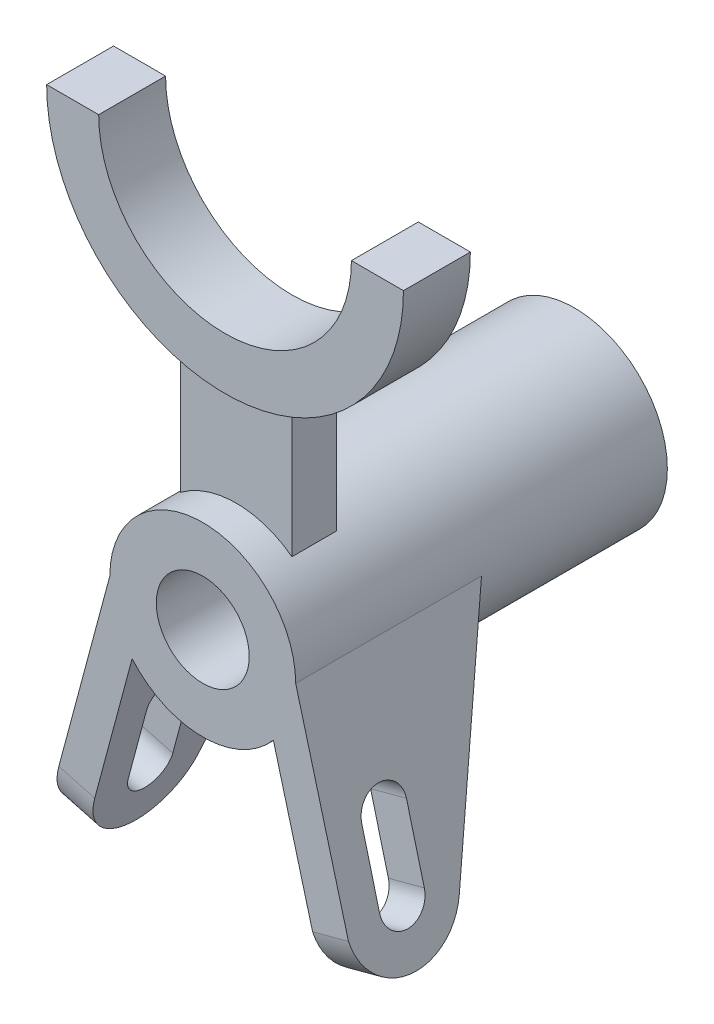
ISO-10303-21;
HEADER;
FILE_DESCRIPTION(('STEP AP214'),'2;1');
FILE_NAME('part.step','',(''),(''),'','','');
FILE_SCHEMA(('AUTOMOTIVE_DESIGN { 1 0 10303 214 1 1 1 1 }'));
ENDSEC;
DATA;
#1=APPLICATION_CONTEXT('core data for automotive mechanical design processes');
#2=APPLICATION_PROTOCOL_DEFINITION('international standard','automotive_design',2000,#1);
#3=PRODUCT_CONTEXT('',#1,'mechanical');
#4=PRODUCT('Part','Part','',(#3));
#5=PRODUCT_RELATED_PRODUCT_CATEGORY('part','',(#4));
#6=PRODUCT_DEFINITION_FORMATION('','',#4);
#7=PRODUCT_DEFINITION_CONTEXT('part definition',#1,'design');
#8=PRODUCT_DEFINITION('design','',#6,#7);
#9=PRODUCT_DEFINITION_SHAPE('','',#8);
#10=(LENGTH_UNIT() NAMED_UNIT(*) SI_UNIT(.MILLI.,.METRE.));
#11=(NAMED_UNIT(*) PLANE_ANGLE_UNIT() SI_UNIT($,.RADIAN.));
#12=(NAMED_UNIT(*) SI_UNIT($,.STERADIAN.) SOLID_ANGLE_UNIT());
#13=UNCERTAINTY_MEASURE_WITH_UNIT(LENGTH_MEASURE(1.E-05),#10,'distance_accuracy_value','');
#14=(GEOMETRIC_REPRESENTATION_CONTEXT(3) GLOBAL_UNCERTAINTY_ASSIGNED_CONTEXT((#13)) GLOBAL_UNIT_ASSIGNED_CONTEXT((#10,
#11,#12)) REPRESENTATION_CONTEXT('',''));
#15=CARTESIAN_POINT('',(0.,0.,0.));
#16=DIRECTION('',(0.,0.,1.));
#17=DIRECTION('',(1.,0.,0.));
#18=AXIS2_PLACEMENT_3D('',#15,#16,#17);
#19=CARTESIAN_POINT('',(0.,0.,-85.));
#20=DIRECTION('',(0.,0.,1.));
#21=DIRECTION('',(1.,0.,0.));
#22=AXIS2_PLACEMENT_3D('',#19,#20,#21);
#23=PLANE('',#22);
#24=CARTESIAN_POINT('',(0.,0.,-85.));
#25=DIRECTION('',(0.,0.,1.));
#26=DIRECTION('',(1.,0.,0.));
#27=AXIS2_PLACEMENT_3D('',#24,#25,#26);
#28=CIRCLE('',#27,25.);
#29=CARTESIAN_POINT('',(25.,0.,-85.));
#30=VERTEX_POINT('',#29);
#31=EDGE_CURVE('E376',#30,#30,#28,.T.);
#32=ORIENTED_EDGE('',*,*,#31,.F.);
#33=EDGE_LOOP('',(#32));
#34=FACE_BOUND('',#33,.T.);
#35=CARTESIAN_POINT('',(0.,0.,-85.));
#36=DIRECTION('',(0.,0.,-1.));
#37=DIRECTION('',(-1.,0.,0.));
#38=AXIS2_PLACEMENT_3D('',#35,#36,#37);
#39=CIRCLE('',#38,12.5);
#40=CARTESIAN_POINT('',(-12.5,0.,-85.));
#41=VERTEX_POINT('',#40);
#42=EDGE_CURVE('E835',#41,#41,#39,.T.);
#43=ORIENTED_EDGE('',*,*,#42,.F.);
#44=EDGE_LOOP('',(#43));
#45=FACE_BOUND('',#44,.T.);
#46=ADVANCED_FACE('F171',(#34,#45),#23,.F.);
#47=CARTESIAN_POINT('',(13.6660592844148,3.6618095489748,15.));
#48=DIRECTION('',(-0.965925826289068,-0.258819045102521,0.));
#49=DIRECTION('',(0.258819045102521,-0.965925826289068,0.));
#50=AXIS2_PLACEMENT_3D('',#47,#48,#49);
#51=PLANE('',#50);
#52=DIRECTION('',(-0.258813930198797,0.965906737208493,-0.0062868553582629));
#53=VECTOR('',#52,1.);
#54=CARTESIAN_POINT('',(13.6762362329052,3.62382866014261,-6.254308426666));
#55=LINE('',#54,#53);
#56=CARTESIAN_POINT('',(29.0679140749461,-53.8186950600859,-5.88042881269172));
#57=VERTEX_POINT('',#56);
#58=CARTESIAN_POINT('',(24.1503522179982,-35.4661043605937,-5.99988142517744));
#59=VERTEX_POINT('',#58);
#60=EDGE_CURVE('E548',#57,#59,#55,.T.);
#61=ORIENTED_EDGE('',*,*,#60,.T.);
#62=CARTESIAN_POINT('',(24.1405892705951,-35.4296685448535,0.));
#63=DIRECTION('',(0.965925826289068,0.258819045102521,0.));
#64=DIRECTION('',(-0.258819045102521,0.965925826289068,0.));
#65=AXIS2_PLACEMENT_3D('',#62,#63,#64);
#66=CIRCLE('',#65,5.99999999999999);
#67=CARTESIAN_POINT('',(24.1308263231919,-35.3932327291135,5.99988142517744));
#68=VERTEX_POINT('',#67);
#69=EDGE_CURVE('E551',#59,#68,#66,.T.);
#70=ORIENTED_EDGE('',*,*,#69,.T.);
#71=DIRECTION('',(-0.258813930198797,0.965906737208493,-0.00628685535826281));
#72=VECTOR('',#71,1.);
#73=CARTESIAN_POINT('',(13.6567103380989,3.69670029162289,5.74545442368889));
#74=LINE('',#73,#72);
#75=CARTESIAN_POINT('',(29.0483881801398,-53.7458234286057,6.11933403766316));
#76=VERTEX_POINT('',#75);
#77=EDGE_CURVE('E555',#76,#68,#74,.T.);
#78=ORIENTED_EDGE('',*,*,#77,.F.);
#79=CARTESIAN_POINT('',(29.058151127543,-53.7822592443458,0.119452612485716));
#80=DIRECTION('',(0.965925826289068,0.258819045102521,0.));
#81=DIRECTION('',(-0.258819045102521,0.965925826289068,0.));
#82=AXIS2_PLACEMENT_3D('',#79,#80,#81);
#83=CIRCLE('',#82,5.99999999999999);
#84=EDGE_CURVE('E557',#76,#57,#83,.T.);
#85=ORIENTED_EDGE('',*,*,#84,.T.);
#86=EDGE_LOOP('',(#61,#70,#78,#85));
#87=FACE_BOUND('',#86,.T.);
#88=CARTESIAN_POINT('',(29.058151127543,-53.7822592443458,0.119452612485716));
#89=DIRECTION('',(0.965925826289068,0.258819045102521,0.));
#90=DIRECTION('',(-0.258819045102521,0.965925826289068,0.));
#91=AXIS2_PLACEMENT_3D('',#88,#89,#90);
#92=CIRCLE('',#91,15.);
#93=CARTESIAN_POINT('',(30.3785552849601,-58.7100746463516,-13.9863323080648));
#94=VERTEX_POINT('',#93);
#95=CARTESIAN_POINT('',(29.5471280145511,-55.6071458303872,15.));
#96=VERTEX_POINT('',#95);
#97=EDGE_CURVE('E542',#94,#96,#92,.F.);
#98=ORIENTED_EDGE('',*,*,#97,.T.);
#99=DIRECTION('',(-0.258819045102521,0.965925826289068,0.));
#100=VECTOR('',#99,1.);
#101=CARTESIAN_POINT('',(13.6660592844148,3.6618095489748,15.));
#102=LINE('',#101,#100);
#103=CARTESIAN_POINT('',(19.0006831834728,-16.2472778815805,15.));
#104=VERTEX_POINT('',#103);
#105=EDGE_CURVE('E360',#96,#104,#102,.T.);
#106=ORIENTED_EDGE('',*,*,#105,.T.);
#107=DIRECTION('',(0.,0.,-1.));
#108=VECTOR('',#107,1.);
#109=CARTESIAN_POINT('',(19.0006831834728,-16.2472778815805,15.));
#110=LINE('',#109,#108);
#111=CARTESIAN_POINT('',(19.0006831834727,-16.2472778815805,-29.885639918257));
#112=VERTEX_POINT('',#111);
#113=EDGE_CURVE('E355',#104,#112,#110,.T.);
#114=ORIENTED_EDGE('',*,*,#113,.T.);
#115=DIRECTION('',(0.243389718903895,-0.908342796989242,0.340109993810301));
#116=VECTOR('',#115,1.);
#117=CARTESIAN_POINT('',(16.7570525080527,-7.87393420749297,-33.0208636186099));
#118=LINE('',#117,#116);
#119=EDGE_CURVE('E333',#112,#94,#118,.T.);
#120=ORIENTED_EDGE('',*,*,#119,.T.);
#121=EDGE_LOOP('',(#98,#106,#114,#120));
#122=FACE_BOUND('',#121,.T.);
#123=ADVANCED_FACE('F468',(#87,#122),#51,.T.);
#124=CARTESIAN_POINT('',(23.3253175473055,6.25000000000001,15.));
#125=DIRECTION('',(0.965925826289068,0.258819045102521,0.));
#126=DIRECTION('',(-0.258819045102521,0.965925826289068,0.));
#127=AXIS2_PLACEMENT_3D('',#124,#125,#126);
#128=PLANE('',#127);
#129=DIRECTION('',(-0.258813930198797,0.965906737208493,-0.0062868553582629));
#130=VECTOR('',#129,1.);
#131=CARTESIAN_POINT('',(23.3354944957959,6.21201911116782,-6.254308426666));
#132=LINE('',#131,#130);
#133=CARTESIAN_POINT('',(38.7271723378368,-51.2305046090607,-5.88042881269172));
#134=VERTEX_POINT('',#133);
#135=CARTESIAN_POINT('',(33.8096104808889,-32.8779139095685,-5.99988142517744));
#136=VERTEX_POINT('',#135);
#137=EDGE_CURVE('E547',#134,#136,#132,.T.);
#138=ORIENTED_EDGE('',*,*,#137,.F.);
#139=CARTESIAN_POINT('',(38.7174093904336,-51.1940687933206,0.119452612485716));
#140=DIRECTION('',(0.965925826289068,0.258819045102521,0.));
#141=DIRECTION('',(-0.258819045102521,0.965925826289068,0.));
#142=AXIS2_PLACEMENT_3D('',#139,#140,#141);
#143=CIRCLE('',#142,5.99999999999999);
#144=CARTESIAN_POINT('',(38.7076464430305,-51.1576329775805,6.11933403766316));
#145=VERTEX_POINT('',#144);
#146=EDGE_CURVE('E552',#145,#134,#143,.T.);
#147=ORIENTED_EDGE('',*,*,#146,.F.);
#148=DIRECTION('',(-0.258813930198797,0.965906737208493,-0.00628685535826281));
#149=VECTOR('',#148,1.);
#150=CARTESIAN_POINT('',(23.3159686009896,6.2848907426481,5.74545442368889));
#151=LINE('',#150,#149);
#152=CARTESIAN_POINT('',(33.7900845860826,-32.8050422780883,5.99988142517744));
#153=VERTEX_POINT('',#152);
#154=EDGE_CURVE('E564',#145,#153,#151,.T.);
#155=ORIENTED_EDGE('',*,*,#154,.T.);
#156=CARTESIAN_POINT('',(33.7998475334857,-32.8414780938283,0.));
#157=DIRECTION('',(0.965925826289068,0.258819045102521,0.));
#158=DIRECTION('',(-0.258819045102521,0.965925826289068,0.));
#159=AXIS2_PLACEMENT_3D('',#156,#157,#158);
#160=CIRCLE('',#159,5.99999999999999);
#161=EDGE_CURVE('E562',#136,#153,#160,.T.);
#162=ORIENTED_EDGE('',*,*,#161,.F.);
#163=EDGE_LOOP('',(#138,#147,#155,#162));
#164=FACE_BOUND('',#163,.T.);
#165=DIRECTION('',(0.258819045102521,-0.965925826289068,0.));
#166=VECTOR('',#165,1.);
#167=CARTESIAN_POINT('',(23.3253175473055,6.25000000000001,15.));
#168=LINE('',#167,#166);
#169=CARTESIAN_POINT('',(25.,0.,15.));
#170=VERTEX_POINT('',#169);
#171=CARTESIAN_POINT('',(39.2063862774418,-53.018955379362,15.));
#172=VERTEX_POINT('',#171);
#173=EDGE_CURVE('E356',#170,#172,#168,.T.);
#174=ORIENTED_EDGE('',*,*,#173,.T.);
#175=CARTESIAN_POINT('',(38.7174093904336,-51.1940687933206,0.119452612485716));
#176=DIRECTION('',(0.965925826289068,0.258819045102521,0.));
#177=DIRECTION('',(-0.258819045102521,0.965925826289068,0.));
#178=AXIS2_PLACEMENT_3D('',#175,#176,#177);
#179=CIRCLE('',#178,15.);
#180=CARTESIAN_POINT('',(40.0378135478507,-56.1218841953264,-13.9863323080648));
#181=VERTEX_POINT('',#180);
#182=EDGE_CURVE('E348',#181,#172,#179,.F.);
#183=ORIENTED_EDGE('',*,*,#182,.F.);
#184=DIRECTION('',(0.243389718903895,-0.908342796989242,0.340109993810301));
#185=VECTOR('',#184,1.);
#186=CARTESIAN_POINT('',(26.4163107709434,-5.28574375646776,-33.0208636186099));
#187=LINE('',#186,#185);
#188=CARTESIAN_POINT('',(25.,0.,-35.));
#189=VERTEX_POINT('',#188);
#190=EDGE_CURVE('E194',#189,#181,#187,.T.);
#191=ORIENTED_EDGE('',*,*,#190,.F.);
#192=DIRECTION('',(0.,0.,-1.));
#193=VECTOR('',#192,1.);
#194=CARTESIAN_POINT('',(25.,0.,15.));
#195=LINE('',#194,#193);
#196=EDGE_CURVE('E346',#170,#189,#195,.T.);
#197=ORIENTED_EDGE('',*,*,#196,.F.);
#198=EDGE_LOOP('',(#174,#183,#191,#197));
#199=FACE_BOUND('',#198,.T.);
#200=ADVANCED_FACE('F345',(#164,#199),#128,.T.);
#201=CARTESIAN_POINT('',(-13.6660592844148,3.6618095489748,-35.));
#202=DIRECTION('',(0.965925826289068,-0.258819045102521,0.));
#203=DIRECTION('',(0.258819045102521,0.965925826289068,0.));
#204=AXIS2_PLACEMENT_3D('',#201,#202,#203);
#205=PLANE('',#204);
#206=DIRECTION('',(0.258819045102521,0.965925826289068,0.));
#207=VECTOR('',#206,1.);
#208=CARTESIAN_POINT('',(-13.6660592844148,3.6618095489748,15.));
#209=LINE('',#208,#207);
#210=CARTESIAN_POINT('',(-29.058151127543,-53.7822592443458,15.));
#211=VERTEX_POINT('',#210);
#212=CARTESIAN_POINT('',(-19.0006831834728,-16.2472778815805,15.));
#213=VERTEX_POINT('',#212);
#214=EDGE_CURVE('E366',#211,#213,#209,.T.);
#215=ORIENTED_EDGE('',*,*,#214,.F.);
#216=CARTESIAN_POINT('',(-29.058151127543,-53.7822592443458,0.));
#217=DIRECTION('',(-0.965925826289068,0.258819045102521,0.));
#218=DIRECTION('',(-0.258819045102521,-0.965925826289068,0.));
#219=AXIS2_PLACEMENT_3D('',#216,#217,#218);
#220=CIRCLE('',#219,15.);
#221=CARTESIAN_POINT('',(-30.3719096495072,-58.6852727971928,-14.1150450458567));
#222=VERTEX_POINT('',#221);
#223=EDGE_CURVE('E612',#211,#222,#220,.F.);
#224=ORIENTED_EDGE('',*,*,#223,.T.);
#225=DIRECTION('',(0.243549498689848,0.90893910326844,-0.33839820956602));
#226=VECTOR('',#225,1.);
#227=CARTESIAN_POINT('',(-16.7424177797145,-7.81931665777995,-33.0524506691216));
#228=LINE('',#227,#226);
#229=CARTESIAN_POINT('',(-19.0006831834727,-16.2472778815805,-29.9147190233265));
#230=VERTEX_POINT('',#229);
#231=EDGE_CURVE('E615',#222,#230,#228,.T.);
#232=ORIENTED_EDGE('',*,*,#231,.T.);
#233=DIRECTION('',(0.,0.,1.));
#234=VECTOR('',#233,1.);
#235=CARTESIAN_POINT('',(-19.0006831834728,-16.2472778815805,-35.));
#236=LINE('',#235,#234);
#237=EDGE_CURVE('E369',#230,#213,#236,.T.);
#238=ORIENTED_EDGE('',*,*,#237,.T.);
#239=EDGE_LOOP('',(#215,#224,#232,#238));
#240=FACE_BOUND('',#239,.T.);
#241=DIRECTION('',(0.258819045102521,0.965925826289068,0.));
#242=VECTOR('',#241,1.);
#243=CARTESIAN_POINT('',(-13.6660592844148,3.6618095489748,6.));
#244=LINE('',#243,#242);
#245=CARTESIAN_POINT('',(-29.058151127543,-53.7822592443458,6.));
#246=VERTEX_POINT('',#245);
#247=CARTESIAN_POINT('',(-24.140589270595,-35.4296685448535,6.));
#248=VERTEX_POINT('',#247);
#249=EDGE_CURVE('E577',#246,#248,#244,.T.);
#250=ORIENTED_EDGE('',*,*,#249,.T.);
#251=CARTESIAN_POINT('',(-24.1405892705951,-35.4296685448535,0.));
#252=DIRECTION('',(-0.965925826289068,0.258819045102521,0.));
#253=DIRECTION('',(-0.258819045102521,-0.965925826289068,0.));
#254=AXIS2_PLACEMENT_3D('',#251,#252,#253);
#255=CIRCLE('',#254,6.);
#256=CARTESIAN_POINT('',(-24.1405892705951,-35.4296685448535,-6.));
#257=VERTEX_POINT('',#256);
#258=EDGE_CURVE('E580',#248,#257,#255,.T.);
#259=ORIENTED_EDGE('',*,*,#258,.T.);
#260=DIRECTION('',(0.258819045102521,0.965925826289068,0.));
#261=VECTOR('',#260,1.);
#262=CARTESIAN_POINT('',(-13.6660592844148,3.6618095489748,-6.));
#263=LINE('',#262,#261);
#264=CARTESIAN_POINT('',(-29.058151127543,-53.7822592443458,-6.));
#265=VERTEX_POINT('',#264);
#266=EDGE_CURVE('E584',#265,#257,#263,.T.);
#267=ORIENTED_EDGE('',*,*,#266,.F.);
#268=CARTESIAN_POINT('',(-29.058151127543,-53.7822592443458,0.));
#269=DIRECTION('',(-0.965925826289068,0.258819045102521,0.));
#270=DIRECTION('',(-0.258819045102521,-0.965925826289068,0.));
#271=AXIS2_PLACEMENT_3D('',#268,#269,#270);
#272=CIRCLE('',#271,6.);
#273=EDGE_CURVE('E587',#265,#246,#272,.T.);
#274=ORIENTED_EDGE('',*,*,#273,.T.);
#275=EDGE_LOOP('',(#250,#259,#267,#274));
#276=FACE_BOUND('',#275,.T.);
#277=ADVANCED_FACE('F526',(#240,#276),#205,.T.);
#278=CARTESIAN_POINT('',(-23.3253175473055,6.25000000000001,-35.));
#279=DIRECTION('',(-0.965925826289068,0.258819045102521,0.));
#280=DIRECTION('',(-0.258819045102521,-0.965925826289068,0.));
#281=AXIS2_PLACEMENT_3D('',#278,#279,#280);
#282=PLANE('',#281);
#283=CARTESIAN_POINT('',(-38.7174093904336,-51.1940687933206,0.));
#284=DIRECTION('',(-0.965925826289068,0.258819045102521,0.));
#285=DIRECTION('',(-0.258819045102521,-0.965925826289068,0.));
#286=AXIS2_PLACEMENT_3D('',#283,#284,#285);
#287=CIRCLE('',#286,15.);
#288=CARTESIAN_POINT('',(-38.7174093904336,-51.1940687933206,15.));
#289=VERTEX_POINT('',#288);
#290=CARTESIAN_POINT('',(-40.0311679123978,-56.0970823461676,-14.1150450458567));
#291=VERTEX_POINT('',#290);
#292=EDGE_CURVE('E611',#289,#291,#287,.F.);
#293=ORIENTED_EDGE('',*,*,#292,.F.);
#294=DIRECTION('',(-0.258819045102521,-0.965925826289068,0.));
#295=VECTOR('',#294,1.);
#296=CARTESIAN_POINT('',(-23.3253175473055,6.25000000000001,15.));
#297=LINE('',#296,#295);
#298=CARTESIAN_POINT('',(-25.,0.,15.));
#299=VERTEX_POINT('',#298);
#300=EDGE_CURVE('E358',#299,#289,#297,.T.);
#301=ORIENTED_EDGE('',*,*,#300,.F.);
#302=DIRECTION('',(0.,0.,1.));
#303=VECTOR('',#302,1.);
#304=CARTESIAN_POINT('',(-25.,0.,-35.));
#305=LINE('',#304,#303);
#306=CARTESIAN_POINT('',(-25.,0.,-35.));
#307=VERTEX_POINT('',#306);
#308=EDGE_CURVE('E368',#307,#299,#305,.T.);
#309=ORIENTED_EDGE('',*,*,#308,.F.);
#310=DIRECTION('',(0.243549498689848,0.90893910326844,-0.33839820956602));
#311=VECTOR('',#310,1.);
#312=CARTESIAN_POINT('',(-26.4016760426052,-5.23112620675473,-33.0524506691216));
#313=LINE('',#312,#311);
#314=EDGE_CURVE('E616',#291,#307,#313,.T.);
#315=ORIENTED_EDGE('',*,*,#314,.F.);
#316=EDGE_LOOP('',(#293,#301,#309,#315));
#317=FACE_BOUND('',#316,.T.);
#318=DIRECTION('',(0.258819045102521,0.965925826289068,0.));
#319=VECTOR('',#318,1.);
#320=CARTESIAN_POINT('',(-23.3253175473055,6.25000000000001,6.));
#321=LINE('',#320,#319);
#322=CARTESIAN_POINT('',(-38.7174093904336,-51.1940687933206,6.));
#323=VERTEX_POINT('',#322);
#324=CARTESIAN_POINT('',(-33.7998475334857,-32.8414780938283,6.));
#325=VERTEX_POINT('',#324);
#326=EDGE_CURVE('E571',#323,#325,#321,.T.);
#327=ORIENTED_EDGE('',*,*,#326,.F.);
#328=CARTESIAN_POINT('',(-38.7174093904336,-51.1940687933206,0.));
#329=DIRECTION('',(-0.965925826289068,0.258819045102521,0.));
#330=DIRECTION('',(-0.258819045102521,-0.965925826289068,0.));
#331=AXIS2_PLACEMENT_3D('',#328,#329,#330);
#332=CIRCLE('',#331,6.);
#333=CARTESIAN_POINT('',(-38.7174093904336,-51.1940687933206,-6.));
#334=VERTEX_POINT('',#333);
#335=EDGE_CURVE('E581',#334,#323,#332,.T.);
#336=ORIENTED_EDGE('',*,*,#335,.F.);
#337=DIRECTION('',(0.258819045102521,0.965925826289068,0.));
#338=VECTOR('',#337,1.);
#339=CARTESIAN_POINT('',(-23.3253175473055,6.25000000000001,-6.));
#340=LINE('',#339,#338);
#341=CARTESIAN_POINT('',(-33.7998475334857,-32.8414780938283,-6.));
#342=VERTEX_POINT('',#341);
#343=EDGE_CURVE('E595',#334,#342,#340,.T.);
#344=ORIENTED_EDGE('',*,*,#343,.T.);
#345=CARTESIAN_POINT('',(-33.7998475334857,-32.8414780938283,0.));
#346=DIRECTION('',(-0.965925826289068,0.258819045102521,0.));
#347=DIRECTION('',(-0.258819045102521,-0.965925826289068,0.));
#348=AXIS2_PLACEMENT_3D('',#345,#346,#347);
#349=CIRCLE('',#348,6.);
#350=EDGE_CURVE('E592',#325,#342,#349,.T.);
#351=ORIENTED_EDGE('',*,*,#350,.F.);
#352=EDGE_LOOP('',(#327,#336,#344,#351));
#353=FACE_BOUND('',#352,.T.);
#354=ADVANCED_FACE('F521',(#317,#353),#282,.T.);
#355=CARTESIAN_POINT('',(0.,0.,15.));
#356=DIRECTION('',(0.,0.,1.));
#357=DIRECTION('',(1.,0.,0.));
#358=AXIS2_PLACEMENT_3D('',#355,#356,#357);
#359=PLANE('',#358);
#360=CARTESIAN_POINT('',(0.,0.,15.));
#361=DIRECTION('',(0.,0.,1.));
#362=DIRECTION('',(1.,0.,0.));
#363=AXIS2_PLACEMENT_3D('',#360,#361,#362);
#364=CIRCLE('',#363,12.5);
#365=CARTESIAN_POINT('',(12.5,0.,15.));
#366=VERTEX_POINT('',#365);
#367=EDGE_CURVE('E339',#366,#366,#364,.T.);
#368=ORIENTED_EDGE('',*,*,#367,.F.);
#369=EDGE_LOOP('',(#368));
#370=FACE_BOUND('',#369,.T.);
#371=ORIENTED_EDGE('',*,*,#173,.F.);
#372=CARTESIAN_POINT('',(0.,0.,15.));
#373=DIRECTION('',(0.,0.,1.));
#374=DIRECTION('',(1.,0.,0.));
#375=AXIS2_PLACEMENT_3D('',#372,#373,#374);
#376=CIRCLE('',#375,25.);
#377=EDGE_CURVE('E354',#170,#299,#376,.T.);
#378=ORIENTED_EDGE('',*,*,#377,.T.);
#379=ORIENTED_EDGE('',*,*,#300,.T.);
#380=DIRECTION('',(-0.965925826289068,0.258819045102521,0.));
#381=VECTOR('',#380,1.);
#382=CARTESIAN_POINT('',(-29.058151127543,-53.7822592443458,15.));
#383=LINE('',#382,#381);
#384=EDGE_CURVE('E602',#211,#289,#383,.T.);
#385=ORIENTED_EDGE('',*,*,#384,.F.);
#386=ORIENTED_EDGE('',*,*,#214,.T.);
#387=EDGE_CURVE('E373',#213,#104,#376,.T.);
#388=ORIENTED_EDGE('',*,*,#387,.T.);
#389=ORIENTED_EDGE('',*,*,#105,.F.);
#390=DIRECTION('',(0.965925826289068,0.258819045102521,0.));
#391=VECTOR('',#390,1.);
#392=CARTESIAN_POINT('',(29.5471280145511,-55.6071458303872,15.));
#393=LINE('',#392,#391);
#394=EDGE_CURVE('E349',#96,#172,#393,.T.);
#395=ORIENTED_EDGE('',*,*,#394,.T.);
#396=EDGE_LOOP('',(#371,#378,#379,#385,#386,#388,#389,#395));
#397=FACE_BOUND('',#396,.T.);
#398=ADVANCED_FACE('F480',(#370,#397),#359,.T.);
#399=CARTESIAN_POINT('',(0.,100.,9.));
#400=DIRECTION('',(0.,0.,-1.));
#401=DIRECTION('',(-1.,0.,0.));
#402=AXIS2_PLACEMENT_3D('',#399,#400,#401);
#403=CYLINDRICAL_SURFACE('',#402,34.);
#404=CARTESIAN_POINT('',(0.,100.,-9.));
#405=DIRECTION('',(0.,0.,1.));
#406=DIRECTION('',(1.,0.,0.));
#407=AXIS2_PLACEMENT_3D('',#404,#405,#406);
#408=CIRCLE('',#407,34.);
#409=CARTESIAN_POINT('',(-34.,100.,-9.));
#410=VERTEX_POINT('',#409);
#411=CARTESIAN_POINT('',(34.,100.,-9.));
#412=VERTEX_POINT('',#411);
#413=EDGE_CURVE('E411',#410,#412,#408,.T.);
#414=ORIENTED_EDGE('',*,*,#413,.F.);
#415=DIRECTION('',(0.,0.,-1.));
#416=VECTOR('',#415,1.);
#417=CARTESIAN_POINT('',(-34.,100.,9.));
#418=LINE('',#417,#416);
#419=CARTESIAN_POINT('',(-34.,100.,9.));
#420=VERTEX_POINT('',#419);
#421=EDGE_CURVE('E12',#420,#410,#418,.T.);
#422=ORIENTED_EDGE('',*,*,#421,.F.);
#423=CARTESIAN_POINT('',(0.,100.,9.));
#424=DIRECTION('',(0.,0.,1.));
#425=DIRECTION('',(1.,0.,0.));
#426=AXIS2_PLACEMENT_3D('',#423,#424,#425);
#427=CIRCLE('',#426,34.);
#428=CARTESIAN_POINT('',(34.,100.,9.));
#429=VERTEX_POINT('',#428);
#430=EDGE_CURVE('E412',#420,#429,#427,.T.);
#431=ORIENTED_EDGE('',*,*,#430,.T.);
#432=DIRECTION('',(0.,0.,-1.));
#433=VECTOR('',#432,1.);
#434=CARTESIAN_POINT('',(34.,100.,9.));
#435=LINE('',#434,#433);
#436=EDGE_CURVE('E424',#429,#412,#435,.T.);
#437=ORIENTED_EDGE('',*,*,#436,.T.);
#438=EDGE_LOOP('',(#414,#422,#431,#437));
#439=FACE_BOUND('',#438,.T.);
#440=ADVANCED_FACE('F173',(#439),#403,.F.);
#441=CARTESIAN_POINT('',(0.,100.,9.));
#442=DIRECTION('',(0.,1.,0.));
#443=DIRECTION('',(0.,0.,1.));
#444=AXIS2_PLACEMENT_3D('',#441,#442,#443);
#445=PLANE('',#444);
#446=DIRECTION('',(1.,0.,0.));
#447=VECTOR('',#446,1.);
#448=CARTESIAN_POINT('',(0.,100.,-9.));
#449=LINE('',#448,#447);
#450=CARTESIAN_POINT('',(-48.,100.,-9.));
#451=VERTEX_POINT('',#450);
#452=EDGE_CURVE('E427',#451,#410,#449,.T.);
#453=ORIENTED_EDGE('',*,*,#452,.F.);
#454=DIRECTION('',(0.,0.,-1.));
#455=VECTOR('',#454,1.);
#456=CARTESIAN_POINT('',(-48.,100.,9.));
#457=LINE('',#456,#455);
#458=CARTESIAN_POINT('',(-48.,100.,9.));
#459=VERTEX_POINT('',#458);
#460=EDGE_CURVE('E179',#459,#451,#457,.T.);
#461=ORIENTED_EDGE('',*,*,#460,.F.);
#462=DIRECTION('',(1.,0.,0.));
#463=VECTOR('',#462,1.);
#464=CARTESIAN_POINT('',(0.,100.,9.));
#465=LINE('',#464,#463);
#466=EDGE_CURVE('E415',#459,#420,#465,.T.);
#467=ORIENTED_EDGE('',*,*,#466,.T.);
#468=ORIENTED_EDGE('',*,*,#421,.T.);
#469=EDGE_LOOP('',(#453,#461,#467,#468));
#470=FACE_BOUND('',#469,.T.);
#471=ADVANCED_FACE('F448',(#470),#445,.T.);
#472=CARTESIAN_POINT('',(0.,100.,9.));
#473=DIRECTION('',(0.,0.,-1.));
#474=DIRECTION('',(-1.,0.,0.));
#475=AXIS2_PLACEMENT_3D('',#472,#473,#474);
#476=CYLINDRICAL_SURFACE('',#475,48.);
#477=DIRECTION('',(0.,0.,-1.));
#478=VECTOR('',#477,1.);
#479=CARTESIAN_POINT('',(-15.,54.403947539288,6.));
#480=LINE('',#479,#478);
#481=CARTESIAN_POINT('',(-15.,54.403947539288,6.));
#482=VERTEX_POINT('',#481);
#483=CARTESIAN_POINT('',(-15.,54.403947539288,-6.));
#484=VERTEX_POINT('',#483);
#485=EDGE_CURVE('E408',#482,#484,#480,.T.);
#486=ORIENTED_EDGE('',*,*,#485,.F.);
#487=CARTESIAN_POINT('',(0.,100.,6.));
#488=DIRECTION('',(0.,0.,1.));
#489=DIRECTION('',(1.,0.,0.));
#490=AXIS2_PLACEMENT_3D('',#487,#488,#489);
#491=CIRCLE('',#490,48.);
#492=CARTESIAN_POINT('',(15.,54.403947539288,6.));
#493=VERTEX_POINT('',#492);
#494=EDGE_CURVE('E380',#482,#493,#491,.T.);
#495=ORIENTED_EDGE('',*,*,#494,.T.);
#496=DIRECTION('',(0.,0.,-1.));
#497=VECTOR('',#496,1.);
#498=CARTESIAN_POINT('',(15.,54.403947539288,6.));
#499=LINE('',#498,#497);
#500=CARTESIAN_POINT('',(15.,54.403947539288,-6.));
#501=VERTEX_POINT('',#500);
#502=EDGE_CURVE('E391',#493,#501,#499,.T.);
#503=ORIENTED_EDGE('',*,*,#502,.T.);
#504=CARTESIAN_POINT('',(0.,100.,-6.));
#505=DIRECTION('',(0.,0.,1.));
#506=DIRECTION('',(1.,0.,0.));
#507=AXIS2_PLACEMENT_3D('',#504,#505,#506);
#508=CIRCLE('',#507,48.);
#509=EDGE_CURVE('E379',#484,#501,#508,.T.);
#510=ORIENTED_EDGE('',*,*,#509,.F.);
#511=EDGE_LOOP('',(#486,#495,#503,#510));
#512=FACE_BOUND('',#511,.T.);
#513=CARTESIAN_POINT('',(0.,100.,-9.));
#514=DIRECTION('',(0.,0.,1.));
#515=DIRECTION('',(1.,0.,0.));
#516=AXIS2_PLACEMENT_3D('',#513,#514,#515);
#517=CIRCLE('',#516,48.);
#518=CARTESIAN_POINT('',(48.,100.,-9.));
#519=VERTEX_POINT('',#518);
#520=EDGE_CURVE('E430',#451,#519,#517,.T.);
#521=ORIENTED_EDGE('',*,*,#520,.T.);
#522=DIRECTION('',(0.,0.,-1.));
#523=VECTOR('',#522,1.);
#524=CARTESIAN_POINT('',(48.,100.,9.));
#525=LINE('',#524,#523);
#526=CARTESIAN_POINT('',(48.,100.,9.));
#527=VERTEX_POINT('',#526);
#528=EDGE_CURVE('E436',#527,#519,#525,.T.);
#529=ORIENTED_EDGE('',*,*,#528,.F.);
#530=CARTESIAN_POINT('',(0.,100.,9.));
#531=DIRECTION('',(0.,0.,1.));
#532=DIRECTION('',(1.,0.,0.));
#533=AXIS2_PLACEMENT_3D('',#530,#531,#532);
#534=CIRCLE('',#533,48.);
#535=EDGE_CURVE('E419',#459,#527,#534,.T.);
#536=ORIENTED_EDGE('',*,*,#535,.F.);
#537=ORIENTED_EDGE('',*,*,#460,.T.);
#538=EDGE_LOOP('',(#521,#529,#536,#537));
#539=FACE_BOUND('',#538,.T.);
#540=ADVANCED_FACE('F440',(#512,#539),#476,.T.);
#541=CARTESIAN_POINT('',(0.,100.,9.));
#542=DIRECTION('',(0.,1.,0.));
#543=DIRECTION('',(0.,0.,1.));
#544=AXIS2_PLACEMENT_3D('',#541,#542,#543);
#545=PLANE('',#544);
#546=DIRECTION('',(1.,0.,0.));
#547=VECTOR('',#546,1.);
#548=CARTESIAN_POINT('',(0.,100.,-9.));
#549=LINE('',#548,#547);
#550=EDGE_CURVE('E416',#412,#519,#549,.T.);
#551=ORIENTED_EDGE('',*,*,#550,.F.);
#552=ORIENTED_EDGE('',*,*,#436,.F.);
#553=DIRECTION('',(1.,0.,0.));
#554=VECTOR('',#553,1.);
#555=CARTESIAN_POINT('',(0.,100.,9.));
#556=LINE('',#555,#554);
#557=EDGE_CURVE('E421',#429,#527,#556,.T.);
#558=ORIENTED_EDGE('',*,*,#557,.T.);
#559=ORIENTED_EDGE('',*,*,#528,.T.);
#560=EDGE_LOOP('',(#551,#552,#558,#559));
#561=FACE_BOUND('',#560,.T.);
#562=ADVANCED_FACE('F453',(#561),#545,.T.);
#563=CARTESIAN_POINT('',(0.,0.,9.));
#564=DIRECTION('',(0.,0.,1.));
#565=DIRECTION('',(1.,0.,0.));
#566=AXIS2_PLACEMENT_3D('',#563,#564,#565);
#567=PLANE('',#566);
#568=ORIENTED_EDGE('',*,*,#430,.F.);
#569=ORIENTED_EDGE('',*,*,#466,.F.);
#570=ORIENTED_EDGE('',*,*,#535,.T.);
#571=ORIENTED_EDGE('',*,*,#557,.F.);
#572=EDGE_LOOP('',(#568,#569,#570,#571));
#573=FACE_BOUND('',#572,.T.);
#574=ADVANCED_FACE('F456',(#573),#567,.T.);
#575=CARTESIAN_POINT('',(0.,0.,-9.));
#576=DIRECTION('',(0.,0.,1.));
#577=DIRECTION('',(1.,0.,0.));
#578=AXIS2_PLACEMENT_3D('',#575,#576,#577);
#579=PLANE('',#578);
#580=ORIENTED_EDGE('',*,*,#413,.T.);
#581=ORIENTED_EDGE('',*,*,#550,.T.);
#582=ORIENTED_EDGE('',*,*,#520,.F.);
#583=ORIENTED_EDGE('',*,*,#452,.T.);
#584=EDGE_LOOP('',(#580,#581,#582,#583));
#585=FACE_BOUND('',#584,.T.);
#586=ADVANCED_FACE('F446',(#585),#579,.F.);
#587=CARTESIAN_POINT('',(-15.,0.,6.));
#588=DIRECTION('',(-1.,0.,0.));
#589=DIRECTION('',(0.,0.,1.));
#590=AXIS2_PLACEMENT_3D('',#587,#588,#589);
#591=PLANE('',#590);
#592=DIRECTION('',(0.,1.,0.));
#593=VECTOR('',#592,1.);
#594=CARTESIAN_POINT('',(-15.,0.,-6.));
#595=LINE('',#594,#593);
#596=CARTESIAN_POINT('',(-15.,20.,-6.));
#597=VERTEX_POINT('',#596);
#598=EDGE_CURVE('E394',#597,#484,#595,.T.);
#599=ORIENTED_EDGE('',*,*,#598,.F.);
#600=DIRECTION('',(0.,0.,-1.));
#601=VECTOR('',#600,1.);
#602=CARTESIAN_POINT('',(-15.,20.,6.));
#603=LINE('',#602,#601);
#604=CARTESIAN_POINT('',(-15.,20.,5.99999999999999));
#605=VERTEX_POINT('',#604);
#606=EDGE_CURVE('E406',#605,#597,#603,.T.);
#607=ORIENTED_EDGE('',*,*,#606,.F.);
#608=DIRECTION('',(0.,1.,0.));
#609=VECTOR('',#608,1.);
#610=CARTESIAN_POINT('',(-15.,0.,6.));
#611=LINE('',#610,#609);
#612=EDGE_CURVE('E382',#605,#482,#611,.T.);
#613=ORIENTED_EDGE('',*,*,#612,.T.);
#614=ORIENTED_EDGE('',*,*,#485,.T.);
#615=EDGE_LOOP('',(#599,#607,#613,#614));
#616=FACE_BOUND('',#615,.T.);
#617=ADVANCED_FACE('F463',(#616),#591,.T.);
#618=CARTESIAN_POINT('',(15.,0.,6.));
#619=DIRECTION('',(-1.,0.,0.));
#620=DIRECTION('',(0.,0.,1.));
#621=AXIS2_PLACEMENT_3D('',#618,#619,#620);
#622=PLANE('',#621);
#623=DIRECTION('',(0.,1.,0.));
#624=VECTOR('',#623,1.);
#625=CARTESIAN_POINT('',(15.,0.,-6.));
#626=LINE('',#625,#624);
#627=CARTESIAN_POINT('',(15.,20.,-6.00000000000001));
#628=VERTEX_POINT('',#627);
#629=EDGE_CURVE('E383',#628,#501,#626,.T.);
#630=ORIENTED_EDGE('',*,*,#629,.T.);
#631=ORIENTED_EDGE('',*,*,#502,.F.);
#632=DIRECTION('',(0.,1.,0.));
#633=VECTOR('',#632,1.);
#634=CARTESIAN_POINT('',(15.,0.,6.));
#635=LINE('',#634,#633);
#636=CARTESIAN_POINT('',(15.,20.,5.99999999999999));
#637=VERTEX_POINT('',#636);
#638=EDGE_CURVE('E388',#637,#493,#635,.T.);
#639=ORIENTED_EDGE('',*,*,#638,.F.);
#640=DIRECTION('',(0.,0.,-1.));
#641=VECTOR('',#640,1.);
#642=CARTESIAN_POINT('',(15.,20.,6.));
#643=LINE('',#642,#641);
#644=EDGE_CURVE('E403',#637,#628,#643,.T.);
#645=ORIENTED_EDGE('',*,*,#644,.T.);
#646=EDGE_LOOP('',(#630,#631,#639,#645));
#647=FACE_BOUND('',#646,.T.);
#648=ADVANCED_FACE('F489',(#647),#622,.F.);
#649=CARTESIAN_POINT('',(0.,0.,6.));
#650=DIRECTION('',(0.,0.,1.));
#651=DIRECTION('',(1.,0.,0.));
#652=AXIS2_PLACEMENT_3D('',#649,#650,#651);
#653=PLANE('',#652);
#654=ORIENTED_EDGE('',*,*,#494,.F.);
#655=ORIENTED_EDGE('',*,*,#612,.F.);
#656=CARTESIAN_POINT('',(0.,0.,6.));
#657=DIRECTION('',(0.,0.,1.));
#658=DIRECTION('',(1.,0.,0.));
#659=AXIS2_PLACEMENT_3D('',#656,#657,#658);
#660=CIRCLE('',#659,25.);
#661=EDGE_CURVE('E386',#637,#605,#660,.T.);
#662=ORIENTED_EDGE('',*,*,#661,.F.);
#663=ORIENTED_EDGE('',*,*,#638,.T.);
#664=EDGE_LOOP('',(#654,#655,#662,#663));
#665=FACE_BOUND('',#664,.T.);
#666=ADVANCED_FACE('F486',(#665),#653,.T.);
#667=CARTESIAN_POINT('',(0.,0.,-6.));
#668=DIRECTION('',(0.,0.,1.));
#669=DIRECTION('',(1.,0.,0.));
#670=AXIS2_PLACEMENT_3D('',#667,#668,#669);
#671=PLANE('',#670);
#672=ORIENTED_EDGE('',*,*,#509,.T.);
#673=ORIENTED_EDGE('',*,*,#629,.F.);
#674=CARTESIAN_POINT('',(0.,0.,-6.));
#675=DIRECTION('',(0.,0.,1.));
#676=DIRECTION('',(1.,0.,0.));
#677=AXIS2_PLACEMENT_3D('',#674,#675,#676);
#678=CIRCLE('',#677,25.);
#679=EDGE_CURVE('E397',#628,#597,#678,.T.);
#680=ORIENTED_EDGE('',*,*,#679,.T.);
#681=ORIENTED_EDGE('',*,*,#598,.T.);
#682=EDGE_LOOP('',(#672,#673,#680,#681));
#683=FACE_BOUND('',#682,.T.);
#684=ADVANCED_FACE('F485',(#683),#671,.F.);
#685=CARTESIAN_POINT('',(0.,0.,-85.));
#686=DIRECTION('',(0.,0.,1.));
#687=DIRECTION('',(1.,0.,0.));
#688=AXIS2_PLACEMENT_3D('',#685,#686,#687);
#689=CYLINDRICAL_SURFACE('',#688,25.);
#690=ORIENTED_EDGE('',*,*,#196,.T.);
#691=CARTESIAN_POINT('',(0.,0.,-37.3401819977657));
#692=DIRECTION('',(-0.0880269438278066,0.328521026800385,0.940385661370034));
#693=DIRECTION('',(0.243389718903895,-0.908342796989242,0.340109993810301));
#694=AXIS2_PLACEMENT_3D('',#691,#692,#693);
#695=ELLIPSE('',#694,26.5848375054739,25.);
#696=EDGE_CURVE('E330',#112,#189,#695,.T.);
#697=ORIENTED_EDGE('',*,*,#696,.F.);
#698=ORIENTED_EDGE('',*,*,#113,.F.);
#699=ORIENTED_EDGE('',*,*,#387,.F.);
#700=ORIENTED_EDGE('',*,*,#237,.F.);
#701=CARTESIAN_POINT('',(0.,0.,-37.3268762474652));
#702=DIRECTION('',(0.0875839014642803,0.3268675701898,0.941003003057117));
#703=DIRECTION('',(-0.243549498689848,-0.90893910326844,0.33839820956602));
#704=AXIS2_PLACEMENT_3D('',#701,#702,#703);
#705=ELLIPSE('',#704,26.5673966169931,25.);
#706=EDGE_CURVE('E338',#307,#230,#705,.T.);
#707=ORIENTED_EDGE('',*,*,#706,.F.);
#708=ORIENTED_EDGE('',*,*,#308,.T.);
#709=ORIENTED_EDGE('',*,*,#377,.F.);
#710=EDGE_LOOP('',(#690,#697,#698,#699,#700,#707,#708,#709));
#711=FACE_BOUND('',#710,.T.);
#712=ORIENTED_EDGE('',*,*,#644,.F.);
#713=ORIENTED_EDGE('',*,*,#661,.T.);
#714=ORIENTED_EDGE('',*,*,#606,.T.);
#715=ORIENTED_EDGE('',*,*,#679,.F.);
#716=EDGE_LOOP('',(#712,#713,#714,#715));
#717=FACE_BOUND('',#716,.T.);
#718=ORIENTED_EDGE('',*,*,#31,.T.);
#719=EDGE_LOOP('',(#718));
#720=FACE_BOUND('',#719,.T.);
#721=ADVANCED_FACE('F351',(#711,#717,#720),#689,.T.);
#722=CARTESIAN_POINT('',(-16.7424177797145,-7.81931665777995,-33.0524506691216));
#723=DIRECTION('',(0.0875839014642803,0.3268675701898,0.941003003057117));
#724=DIRECTION('',(0.,-0.944633089783528,0.32812852007411));
#725=AXIS2_PLACEMENT_3D('',#722,#723,#724);
#726=PLANE('',#725);
#727=ORIENTED_EDGE('',*,*,#314,.T.);
#728=ORIENTED_EDGE('',*,*,#706,.T.);
#729=ORIENTED_EDGE('',*,*,#231,.F.);
#730=DIRECTION('',(-0.965925826289068,0.258819045102521,0.));
#731=VECTOR('',#730,1.);
#732=CARTESIAN_POINT('',(-30.3719096495072,-58.6852727971928,-14.1150450458567));
#733=LINE('',#732,#731);
#734=EDGE_CURVE('E619',#222,#291,#733,.T.);
#735=ORIENTED_EDGE('',*,*,#734,.T.);
#736=EDGE_LOOP('',(#727,#728,#729,#735));
#737=FACE_BOUND('',#736,.T.);
#738=ADVANCED_FACE('F484',(#737),#726,.F.);
#739=CARTESIAN_POINT('',(-29.058151127543,-53.7822592443458,0.));
#740=DIRECTION('',(-0.965925826289068,0.258819045102521,0.));
#741=DIRECTION('',(-0.258819045102521,-0.965925826289068,0.));
#742=AXIS2_PLACEMENT_3D('',#739,#740,#741);
#743=CYLINDRICAL_SURFACE('',#742,15.);
#744=ORIENTED_EDGE('',*,*,#292,.T.);
#745=ORIENTED_EDGE('',*,*,#734,.F.);
#746=ORIENTED_EDGE('',*,*,#223,.F.);
#747=ORIENTED_EDGE('',*,*,#384,.T.);
#748=EDGE_LOOP('',(#744,#745,#746,#747));
#749=FACE_BOUND('',#748,.T.);
#750=ADVANCED_FACE('F636',(#749),#743,.T.);
#751=CARTESIAN_POINT('',(-13.6660592844148,3.6618095489748,6.));
#752=DIRECTION('',(0.,0.,1.));
#753=DIRECTION('',(1.,0.,0.));
#754=AXIS2_PLACEMENT_3D('',#751,#752,#753);
#755=PLANE('',#754);
#756=ORIENTED_EDGE('',*,*,#326,.T.);
#757=DIRECTION('',(-0.965925826289068,0.258819045102521,0.));
#758=VECTOR('',#757,1.);
#759=CARTESIAN_POINT('',(-24.140589270595,-35.4296685448535,6.));
#760=LINE('',#759,#758);
#761=EDGE_CURVE('E590',#248,#325,#760,.T.);
#762=ORIENTED_EDGE('',*,*,#761,.F.);
#763=ORIENTED_EDGE('',*,*,#249,.F.);
#764=DIRECTION('',(-0.965925826289068,0.258819045102521,0.));
#765=VECTOR('',#764,1.);
#766=CARTESIAN_POINT('',(-29.058151127543,-53.7822592443458,6.));
#767=LINE('',#766,#765);
#768=EDGE_CURVE('E600',#246,#323,#767,.T.);
#769=ORIENTED_EDGE('',*,*,#768,.T.);
#770=EDGE_LOOP('',(#756,#762,#763,#769));
#771=FACE_BOUND('',#770,.T.);
#772=ADVANCED_FACE('F638',(#771),#755,.F.);
#773=CARTESIAN_POINT('',(-29.058151127543,-53.7822592443458,0.));
#774=DIRECTION('',(-0.965925826289068,0.258819045102521,0.));
#775=DIRECTION('',(-0.258819045102521,-0.965925826289068,0.));
#776=AXIS2_PLACEMENT_3D('',#773,#774,#775);
#777=CYLINDRICAL_SURFACE('',#776,6.);
#778=ORIENTED_EDGE('',*,*,#335,.T.);
#779=ORIENTED_EDGE('',*,*,#768,.F.);
#780=ORIENTED_EDGE('',*,*,#273,.F.);
#781=DIRECTION('',(-0.965925826289068,0.258819045102521,0.));
#782=VECTOR('',#781,1.);
#783=CARTESIAN_POINT('',(-29.058151127543,-53.7822592443458,-6.));
#784=LINE('',#783,#782);
#785=EDGE_CURVE('E603',#265,#334,#784,.T.);
#786=ORIENTED_EDGE('',*,*,#785,.T.);
#787=EDGE_LOOP('',(#778,#779,#780,#786));
#788=FACE_BOUND('',#787,.T.);
#789=ADVANCED_FACE('F644',(#788),#777,.F.);
#790=CARTESIAN_POINT('',(-13.6660592844148,3.6618095489748,-6.));
#791=DIRECTION('',(0.,0.,1.));
#792=DIRECTION('',(1.,0.,0.));
#793=AXIS2_PLACEMENT_3D('',#790,#791,#792);
#794=PLANE('',#793);
#795=ORIENTED_EDGE('',*,*,#343,.F.);
#796=ORIENTED_EDGE('',*,*,#785,.F.);
#797=ORIENTED_EDGE('',*,*,#266,.T.);
#798=DIRECTION('',(-0.965925826289068,0.258819045102521,0.));
#799=VECTOR('',#798,1.);
#800=CARTESIAN_POINT('',(-24.140589270595,-35.4296685448535,-6.));
#801=LINE('',#800,#799);
#802=EDGE_CURVE('E605',#257,#342,#801,.T.);
#803=ORIENTED_EDGE('',*,*,#802,.T.);
#804=EDGE_LOOP('',(#795,#796,#797,#803));
#805=FACE_BOUND('',#804,.T.);
#806=ADVANCED_FACE('F771',(#805),#794,.T.);
#807=CARTESIAN_POINT('',(-24.1405892705951,-35.4296685448535,0.));
#808=DIRECTION('',(-0.965925826289068,0.258819045102521,0.));
#809=DIRECTION('',(-0.258819045102521,-0.965925826289068,0.));
#810=AXIS2_PLACEMENT_3D('',#807,#808,#809);
#811=CYLINDRICAL_SURFACE('',#810,6.);
#812=ORIENTED_EDGE('',*,*,#350,.T.);
#813=ORIENTED_EDGE('',*,*,#802,.F.);
#814=ORIENTED_EDGE('',*,*,#258,.F.);
#815=ORIENTED_EDGE('',*,*,#761,.T.);
#816=EDGE_LOOP('',(#812,#813,#814,#815));
#817=FACE_BOUND('',#816,.T.);
#818=ADVANCED_FACE('F744',(#817),#811,.F.);
#819=CARTESIAN_POINT('',(13.6762362329052,3.62382866014261,-6.254308426666));
#820=DIRECTION('',(0.00162715790052327,-0.00607263595668995,-0.999980237529575));
#821=DIRECTION('',(0.,0.999981561327458,-0.00607264399579144));
#822=AXIS2_PLACEMENT_3D('',#819,#820,#821);
#823=PLANE('',#822);
#824=ORIENTED_EDGE('',*,*,#137,.T.);
#825=DIRECTION('',(0.965925826289068,0.258819045102521,0.));
#826=VECTOR('',#825,1.);
#827=CARTESIAN_POINT('',(24.1503522179982,-35.4661043605937,-5.99988142517744));
#828=LINE('',#827,#826);
#829=EDGE_CURVE('E560',#59,#136,#828,.T.);
#830=ORIENTED_EDGE('',*,*,#829,.F.);
#831=ORIENTED_EDGE('',*,*,#60,.F.);
#832=DIRECTION('',(0.965925826289068,0.258819045102521,0.));
#833=VECTOR('',#832,1.);
#834=CARTESIAN_POINT('',(29.0679140749461,-53.8186950600859,-5.88042881269172));
#835=LINE('',#834,#833);
#836=EDGE_CURVE('E569',#57,#134,#835,.T.);
#837=ORIENTED_EDGE('',*,*,#836,.T.);
#838=EDGE_LOOP('',(#824,#830,#831,#837));
#839=FACE_BOUND('',#838,.T.);
#840=ADVANCED_FACE('F737',(#839),#823,.F.);
#841=CARTESIAN_POINT('',(29.058151127543,-53.7822592443458,0.119452612485716));
#842=DIRECTION('',(0.965925826289068,0.258819045102521,0.));
#843=DIRECTION('',(-0.258819045102521,0.965925826289068,0.));
#844=AXIS2_PLACEMENT_3D('',#841,#842,#843);
#845=CYLINDRICAL_SURFACE('',#844,5.99999999999999);
#846=ORIENTED_EDGE('',*,*,#146,.T.);
#847=ORIENTED_EDGE('',*,*,#836,.F.);
#848=ORIENTED_EDGE('',*,*,#84,.F.);
#849=DIRECTION('',(0.965925826289068,0.258819045102521,0.));
#850=VECTOR('',#849,1.);
#851=CARTESIAN_POINT('',(29.0483881801398,-53.7458234286057,6.11933403766316));
#852=LINE('',#851,#850);
#853=EDGE_CURVE('E572',#76,#145,#852,.T.);
#854=ORIENTED_EDGE('',*,*,#853,.T.);
#855=EDGE_LOOP('',(#846,#847,#848,#854));
#856=FACE_BOUND('',#855,.T.);
#857=ADVANCED_FACE('F743',(#856),#845,.F.);
#858=CARTESIAN_POINT('',(13.6567103380989,3.69670029162289,5.74545442368889));
#859=DIRECTION('',(0.00162715790052325,-0.00607263595668986,-0.999980237529575));
#860=DIRECTION('',(0.,0.999981561327458,-0.00607264399579136));
#861=AXIS2_PLACEMENT_3D('',#858,#859,#860);
#862=PLANE('',#861);
#863=ORIENTED_EDGE('',*,*,#154,.F.);
#864=ORIENTED_EDGE('',*,*,#853,.F.);
#865=ORIENTED_EDGE('',*,*,#77,.T.);
#866=DIRECTION('',(0.965925826289068,0.258819045102521,0.));
#867=VECTOR('',#866,1.);
#868=CARTESIAN_POINT('',(24.1308263231919,-35.3932327291135,5.99988142517744));
#869=LINE('',#868,#867);
#870=EDGE_CURVE('E186',#68,#153,#869,.T.);
#871=ORIENTED_EDGE('',*,*,#870,.T.);
#872=EDGE_LOOP('',(#863,#864,#865,#871));
#873=FACE_BOUND('',#872,.T.);
#874=ADVANCED_FACE('F754',(#873),#862,.T.);
#875=CARTESIAN_POINT('',(24.1405892705951,-35.4296685448535,0.));
#876=DIRECTION('',(0.965925826289068,0.258819045102521,0.));
#877=DIRECTION('',(-0.258819045102521,0.965925826289068,0.));
#878=AXIS2_PLACEMENT_3D('',#875,#876,#877);
#879=CYLINDRICAL_SURFACE('',#878,5.99999999999999);
#880=ORIENTED_EDGE('',*,*,#161,.T.);
#881=ORIENTED_EDGE('',*,*,#870,.F.);
#882=ORIENTED_EDGE('',*,*,#69,.F.);
#883=ORIENTED_EDGE('',*,*,#829,.T.);
#884=EDGE_LOOP('',(#880,#881,#882,#883));
#885=FACE_BOUND('',#884,.T.);
#886=ADVANCED_FACE('F691',(#885),#879,.F.);
#887=CARTESIAN_POINT('',(16.7570525080527,-7.87393420749297,-33.0208636186099));
#888=DIRECTION('',(-0.0880269438278066,0.328521026800385,0.940385661370034));
#889=DIRECTION('',(0.,-0.944050376205773,0.329801284390674));
#890=AXIS2_PLACEMENT_3D('',#887,#888,#889);
#891=PLANE('',#890);
#892=ORIENTED_EDGE('',*,*,#119,.F.);
#893=ORIENTED_EDGE('',*,*,#696,.T.);
#894=ORIENTED_EDGE('',*,*,#190,.T.);
#895=DIRECTION('',(0.965925826289068,0.258819045102521,0.));
#896=VECTOR('',#895,1.);
#897=CARTESIAN_POINT('',(30.3785552849601,-58.7100746463516,-13.9863323080648));
#898=LINE('',#897,#896);
#899=EDGE_CURVE('E543',#94,#181,#898,.T.);
#900=ORIENTED_EDGE('',*,*,#899,.F.);
#901=EDGE_LOOP('',(#892,#893,#894,#900));
#902=FACE_BOUND('',#901,.T.);
#903=ADVANCED_FACE('F331',(#902),#891,.F.);
#904=CARTESIAN_POINT('',(29.058151127543,-53.7822592443458,0.119452612485716));
#905=DIRECTION('',(0.965925826289068,0.258819045102521,0.));
#906=DIRECTION('',(-0.258819045102521,0.965925826289068,0.));
#907=AXIS2_PLACEMENT_3D('',#904,#905,#906);
#908=CYLINDRICAL_SURFACE('',#907,15.);
#909=ORIENTED_EDGE('',*,*,#182,.T.);
#910=ORIENTED_EDGE('',*,*,#394,.F.);
#911=ORIENTED_EDGE('',*,*,#97,.F.);
#912=ORIENTED_EDGE('',*,*,#899,.T.);
#913=EDGE_LOOP('',(#909,#910,#911,#912));
#914=FACE_BOUND('',#913,.T.);
#915=ADVANCED_FACE('F690',(#914),#908,.T.);
#916=CARTESIAN_POINT('',(0.,0.,-85.));
#917=DIRECTION('',(0.,0.,-1.));
#918=DIRECTION('',(-1.,0.,0.));
#919=AXIS2_PLACEMENT_3D('',#916,#917,#918);
#920=CYLINDRICAL_SURFACE('',#919,12.5);
#921=ORIENTED_EDGE('',*,*,#42,.T.);
#922=EDGE_LOOP('',(#921));
#923=FACE_BOUND('',#922,.T.);
#924=ORIENTED_EDGE('',*,*,#367,.T.);
#925=EDGE_LOOP('',(#924));
#926=FACE_BOUND('',#925,.T.);
#927=ADVANCED_FACE('F711',(#923,#926),#920,.F.);
#928=CLOSED_SHELL('',(#46,#123,#200,#277,#354,#398,#440,#471,#540,#562,#574,#586,#617,#648,#666,
#684,#721,#738,#750,#772,#789,#806,#818,#840,#857,#874,#886,#903,#915,#927));
#929=MANIFOLD_SOLID_BREP('B2',#928);
#930=ADVANCED_BREP_SHAPE_REPRESENTATION('',(#18,#929),#14);
#931=SHAPE_DEFINITION_REPRESENTATION(#9,#930);
ENDSEC;
END-ISO-10303-21;
